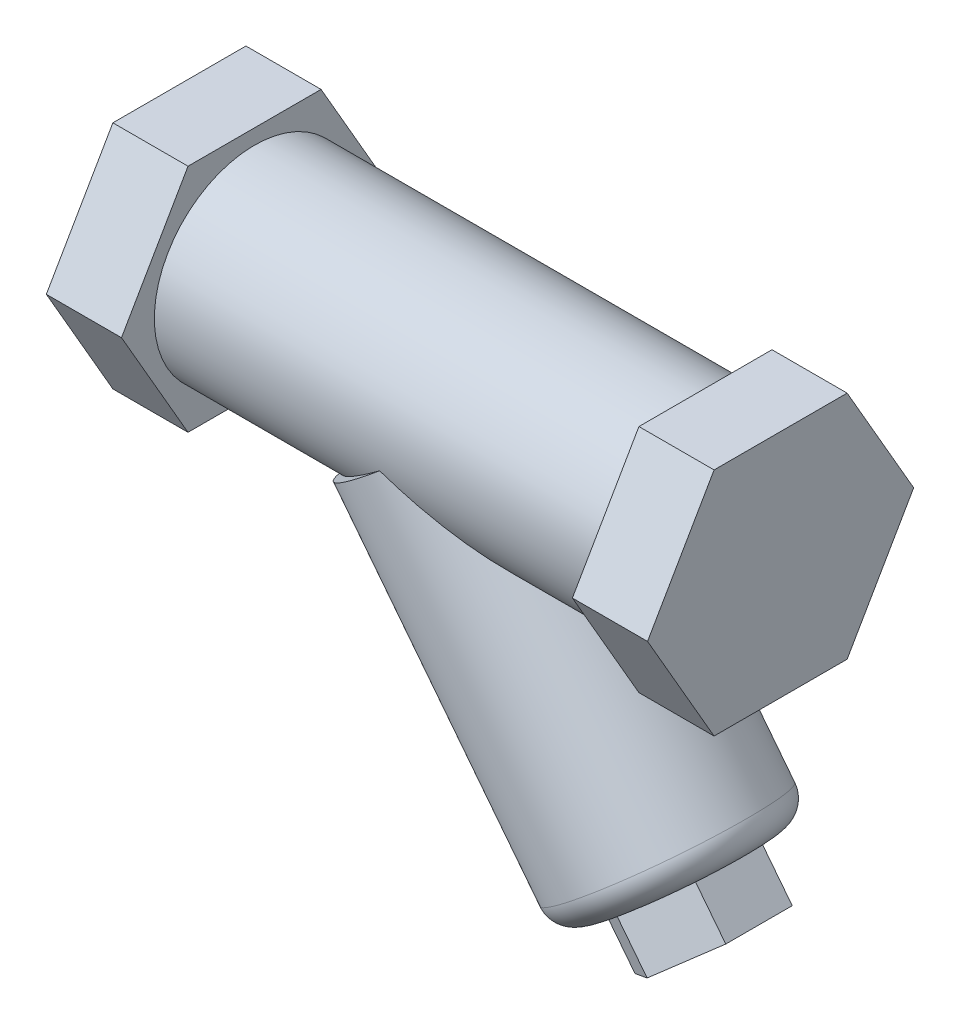
ISO-10303-21;
HEADER;
FILE_DESCRIPTION(('STEP AP214'),'2;1');
FILE_NAME('part.step','',(''),(''),'','','');
FILE_SCHEMA(('AUTOMOTIVE_DESIGN { 1 0 10303 214 1 1 1 1 }'));
ENDSEC;
DATA;
#1=APPLICATION_CONTEXT('core data for automotive mechanical design processes');
#2=APPLICATION_PROTOCOL_DEFINITION('international standard','automotive_design',2000,#1);
#3=PRODUCT_CONTEXT('',#1,'mechanical');
#4=PRODUCT('Part','Part','',(#3));
#5=PRODUCT_RELATED_PRODUCT_CATEGORY('part','',(#4));
#6=PRODUCT_DEFINITION_FORMATION('','',#4);
#7=PRODUCT_DEFINITION_CONTEXT('part definition',#1,'design');
#8=PRODUCT_DEFINITION('design','',#6,#7);
#9=PRODUCT_DEFINITION_SHAPE('','',#8);
#10=(LENGTH_UNIT() NAMED_UNIT(*) SI_UNIT(.MILLI.,.METRE.));
#11=(NAMED_UNIT(*) PLANE_ANGLE_UNIT() SI_UNIT($,.RADIAN.));
#12=(NAMED_UNIT(*) SI_UNIT($,.STERADIAN.) SOLID_ANGLE_UNIT());
#13=UNCERTAINTY_MEASURE_WITH_UNIT(LENGTH_MEASURE(1.E-05),#10,'distance_accuracy_value','');
#14=(GEOMETRIC_REPRESENTATION_CONTEXT(3) GLOBAL_UNCERTAINTY_ASSIGNED_CONTEXT((#13)) GLOBAL_UNIT_ASSIGNED_CONTEXT((#10,
#11,#12)) REPRESENTATION_CONTEXT('',''));
#15=CARTESIAN_POINT('',(0.,0.,0.));
#16=DIRECTION('',(0.,0.,1.));
#17=DIRECTION('',(1.,0.,0.));
#18=AXIS2_PLACEMENT_3D('',#15,#16,#17);
#19=CARTESIAN_POINT('',(100.474515380728,-63.6307453909227,1.58206781009085E-12));
#20=DIRECTION('',(-0.61566147532566,0.788010753606721,0.));
#21=DIRECTION('',(-0.788010753606721,-0.61566147532566,0.));
#22=AXIS2_PLACEMENT_3D('',#19,#20,#21);
#23=PLANE('',#22);
#24=CARTESIAN_POINT('',(100.474515380728,-63.6307453909227,1.58206781009085E-12));
#25=DIRECTION('',(-0.61566147532566,0.788010753606721,0.));
#26=DIRECTION('',(-0.788010753606721,-0.61566147532566,0.));
#27=AXIS2_PLACEMENT_3D('',#24,#25,#26);
#28=CIRCLE('',#27,15.);
#29=CARTESIAN_POINT('',(88.6543540766277,-72.8656675208076,1.58206781009085E-12));
#30=VERTEX_POINT('',#29);
#31=EDGE_CURVE('E11',#30,#30,#28,.F.);
#32=ORIENTED_EDGE('',*,*,#31,.T.);
#33=EDGE_LOOP('',(#32));
#34=FACE_BOUND('',#33,.T.);
#35=DIRECTION('',(0.68243733107874,0.533178477763428,0.5));
#36=VECTOR('',#35,1.);
#37=CARTESIAN_POINT('',(100.474515380736,-63.6307453909227,-13.2715495680807));
#38=LINE('',#37,#36);
#39=CARTESIAN_POINT('',(100.474515380736,-63.6307453909227,-13.2715495680807));
#40=VERTEX_POINT('',#39);
#41=CARTESIAN_POINT('',(109.531516247257,-56.5546407946506,-6.63577478404087));
#42=VERTEX_POINT('',#41);
#43=EDGE_CURVE('E196',#40,#42,#38,.T.);
#44=ORIENTED_EDGE('',*,*,#43,.F.);
#45=DIRECTION('',(0.682437331078741,0.533178477763427,-0.5));
#46=VECTOR('',#45,1.);
#47=CARTESIAN_POINT('',(91.4175145142142,-70.7068499871962,-6.63577478403984));
#48=LINE('',#47,#46);
#49=CARTESIAN_POINT('',(91.4175145142142,-70.7068499871962,-6.63577478403984));
#50=VERTEX_POINT('',#49);
#51=EDGE_CURVE('E193',#50,#40,#48,.T.);
#52=ORIENTED_EDGE('',*,*,#51,.F.);
#53=DIRECTION('',(0.,0.,-1.));
#54=VECTOR('',#53,1.);
#55=CARTESIAN_POINT('',(91.4175145142071,-70.7068499871962,6.63577478404267));
#56=LINE('',#55,#54);
#57=CARTESIAN_POINT('',(91.4175145142071,-70.7068499871962,6.63577478404267));
#58=VERTEX_POINT('',#57);
#59=EDGE_CURVE('E641',#58,#50,#56,.T.);
#60=ORIENTED_EDGE('',*,*,#59,.F.);
#61=DIRECTION('',(-0.68243733107874,-0.533178477763427,-0.5));
#62=VECTOR('',#61,1.);
#63=CARTESIAN_POINT('',(100.474515380728,-63.6307453909227,13.2715495680845));
#64=LINE('',#63,#62);
#65=CARTESIAN_POINT('',(100.474515380728,-63.6307453909227,13.2715495680845));
#66=VERTEX_POINT('',#65);
#67=EDGE_CURVE('E656',#66,#58,#64,.T.);
#68=ORIENTED_EDGE('',*,*,#67,.F.);
#69=DIRECTION('',(-0.682437331078741,-0.533178477763428,0.5));
#70=VECTOR('',#69,1.);
#71=CARTESIAN_POINT('',(109.53151624725,-56.5546407946506,6.63577478404176));
#72=LINE('',#71,#70);
#73=CARTESIAN_POINT('',(109.53151624725,-56.5546407946506,6.63577478404176));
#74=VERTEX_POINT('',#73);
#75=EDGE_CURVE('E59',#74,#66,#72,.T.);
#76=ORIENTED_EDGE('',*,*,#75,.F.);
#77=DIRECTION('',(0.,0.,1.));
#78=VECTOR('',#77,1.);
#79=CARTESIAN_POINT('',(109.531516247257,-56.5546407946506,-6.63577478404087));
#80=LINE('',#79,#78);
#81=EDGE_CURVE('E54',#42,#74,#80,.T.);
#82=ORIENTED_EDGE('',*,*,#81,.F.);
#83=EDGE_LOOP('',(#44,#52,#60,#68,#76,#82));
#84=FACE_BOUND('',#83,.T.);
#85=ADVANCED_FACE('F39',(#34,#84),#23,.F.);
#86=CARTESIAN_POINT('',(15.0000000000077,0.,-26.5581123827227));
#87=DIRECTION('',(1.,0.,0.));
#88=DIRECTION('',(0.,0.,-1.));
#89=AXIS2_PLACEMENT_3D('',#86,#87,#88);
#90=PLANE('',#89);
#91=DIRECTION('',(0.,0.866025403784439,-0.5));
#92=VECTOR('',#91,1.);
#93=CARTESIAN_POINT('',(15.0000000000077,-22.9999999999999,-13.2790561913609));
#94=LINE('',#93,#92);
#95=CARTESIAN_POINT('',(15.0000000000077,-22.9999999999999,-13.2790561913609));
#96=VERTEX_POINT('',#95);
#97=CARTESIAN_POINT('',(15.0000000000077,0.,-26.5581123827227));
#98=VERTEX_POINT('',#97);
#99=EDGE_CURVE('E257',#96,#98,#94,.T.);
#100=ORIENTED_EDGE('',*,*,#99,.T.);
#101=DIRECTION('',(0.,0.866025403784438,0.5));
#102=VECTOR('',#101,1.);
#103=CARTESIAN_POINT('',(15.0000000000077,0.,-26.5581123827227));
#104=LINE('',#103,#102);
#105=CARTESIAN_POINT('',(15.0000000000077,23.0000000000001,-13.2790561913609));
#106=VERTEX_POINT('',#105);
#107=EDGE_CURVE('E260',#98,#106,#104,.T.);
#108=ORIENTED_EDGE('',*,*,#107,.T.);
#109=DIRECTION('',(0.,0.,1.));
#110=VECTOR('',#109,1.);
#111=CARTESIAN_POINT('',(15.0000000000077,23.0000000000001,-13.2790561913609));
#112=LINE('',#111,#110);
#113=CARTESIAN_POINT('',(15.0000000000006,23.0000000000031,13.2790561913618));
#114=VERTEX_POINT('',#113);
#115=EDGE_CURVE('E263',#106,#114,#112,.T.);
#116=ORIENTED_EDGE('',*,*,#115,.T.);
#117=DIRECTION('',(0.,-0.866025403784438,0.5));
#118=VECTOR('',#117,1.);
#119=CARTESIAN_POINT('',(15.0000000000006,23.0000000000031,13.2790561913618));
#120=LINE('',#119,#118);
#121=CARTESIAN_POINT('',(15.0000000000006,3.21964677141295E-12,26.5581123827228));
#122=VERTEX_POINT('',#121);
#123=EDGE_CURVE('E265',#114,#122,#120,.T.);
#124=ORIENTED_EDGE('',*,*,#123,.T.);
#125=DIRECTION('',(0.,-0.866025403784438,-0.5));
#126=VECTOR('',#125,1.);
#127=CARTESIAN_POINT('',(15.0000000000006,3.21964677141295E-12,26.5581123827228));
#128=LINE('',#127,#126);
#129=CARTESIAN_POINT('',(15.0000000000006,-22.9999999999969,13.2790561913618));
#130=VERTEX_POINT('',#129);
#131=EDGE_CURVE('E267',#122,#130,#128,.T.);
#132=ORIENTED_EDGE('',*,*,#131,.T.);
#133=DIRECTION('',(0.,0.,-1.));
#134=VECTOR('',#133,1.);
#135=CARTESIAN_POINT('',(15.0000000000006,-22.9999999999969,13.2790561913618));
#136=LINE('',#135,#134);
#137=EDGE_CURVE('E269',#130,#96,#136,.T.);
#138=ORIENTED_EDGE('',*,*,#137,.T.);
#139=EDGE_LOOP('',(#100,#108,#116,#124,#132,#138));
#140=FACE_BOUND('',#139,.T.);
#141=CARTESIAN_POINT('',(15.0000000000006,3.21964677141295E-12,0.));
#142=DIRECTION('',(1.,0.,0.));
#143=DIRECTION('',(0.,0.,-1.));
#144=AXIS2_PLACEMENT_3D('',#141,#142,#143);
#145=CIRCLE('',#144,20.);
#146=CARTESIAN_POINT('',(15.0000000000006,3.21964677141295E-12,-19.9999999999999));
#147=VERTEX_POINT('',#146);
#148=EDGE_CURVE('E250',#147,#147,#145,.T.);
#149=ORIENTED_EDGE('',*,*,#148,.F.);
#150=EDGE_LOOP('',(#149));
#151=FACE_BOUND('',#150,.T.);
#152=ADVANCED_FACE('F335',(#140,#151),#90,.T.);
#153=CARTESIAN_POINT('',(15.0000000000077,-22.9999999999999,-13.2790561913609));
#154=DIRECTION('',(0.,0.5,0.866025403784439));
#155=DIRECTION('',(0.,-0.866025403784439,0.5));
#156=AXIS2_PLACEMENT_3D('',#153,#154,#155);
#157=PLANE('',#156);
#158=DIRECTION('',(0.,0.866025403784439,-0.5));
#159=VECTOR('',#158,1.);
#160=CARTESIAN_POINT('',(7.105427357601E-12,-22.999999999999,-13.2790561913615));
#161=LINE('',#160,#159);
#162=CARTESIAN_POINT('',(7.105427357601E-12,-22.999999999999,-13.2790561913615));
#163=VERTEX_POINT('',#162);
#164=CARTESIAN_POINT('',(7.105427357601E-12,8.88178419700125E-13,-26.5581123827231));
#165=VERTEX_POINT('',#164);
#166=EDGE_CURVE('E254',#163,#165,#161,.T.);
#167=ORIENTED_EDGE('',*,*,#166,.T.);
#168=DIRECTION('',(-1.,0.,0.));
#169=VECTOR('',#168,1.);
#170=CARTESIAN_POINT('',(15.0000000000077,0.,-26.5581123827227));
#171=LINE('',#170,#169);
#172=EDGE_CURVE('E297',#98,#165,#171,.T.);
#173=ORIENTED_EDGE('',*,*,#172,.F.);
#174=ORIENTED_EDGE('',*,*,#99,.F.);
#175=DIRECTION('',(-1.,0.,0.));
#176=VECTOR('',#175,1.);
#177=CARTESIAN_POINT('',(15.0000000000077,-22.9999999999999,-13.2790561913609));
#178=LINE('',#177,#176);
#179=EDGE_CURVE('E271',#96,#163,#178,.T.);
#180=ORIENTED_EDGE('',*,*,#179,.T.);
#181=EDGE_LOOP('',(#167,#173,#174,#180));
#182=FACE_BOUND('',#181,.T.);
#183=ADVANCED_FACE('F340',(#182),#157,.F.);
#184=CARTESIAN_POINT('',(15.0000000000077,0.,-26.5581123827227));
#185=DIRECTION('',(0.,-0.5,0.866025403784438));
#186=DIRECTION('',(0.,-0.866025403784439,-0.5));
#187=AXIS2_PLACEMENT_3D('',#184,#185,#186);
#188=PLANE('',#187);
#189=DIRECTION('',(0.,0.866025403784438,0.5));
#190=VECTOR('',#189,1.);
#191=CARTESIAN_POINT('',(7.105427357601E-12,8.88178419700125E-13,-26.5581123827231));
#192=LINE('',#191,#190);
#193=CARTESIAN_POINT('',(7.105427357601E-12,23.000000000001,-13.2790561913616));
#194=VERTEX_POINT('',#193);
#195=EDGE_CURVE('E274',#165,#194,#192,.T.);
#196=ORIENTED_EDGE('',*,*,#195,.T.);
#197=DIRECTION('',(-1.,0.,0.));
#198=VECTOR('',#197,1.);
#199=CARTESIAN_POINT('',(15.0000000000077,23.0000000000001,-13.2790561913609));
#200=LINE('',#199,#198);
#201=EDGE_CURVE('E294',#106,#194,#200,.T.);
#202=ORIENTED_EDGE('',*,*,#201,.F.);
#203=ORIENTED_EDGE('',*,*,#107,.F.);
#204=ORIENTED_EDGE('',*,*,#172,.T.);
#205=EDGE_LOOP('',(#196,#202,#203,#204));
#206=FACE_BOUND('',#205,.T.);
#207=ADVANCED_FACE('F568',(#206),#188,.F.);
#208=CARTESIAN_POINT('',(15.0000000000077,23.0000000000001,-13.2790561913609));
#209=DIRECTION('',(0.,-1.,0.));
#210=DIRECTION('',(0.,0.,-1.));
#211=AXIS2_PLACEMENT_3D('',#208,#209,#210);
#212=PLANE('',#211);
#213=DIRECTION('',(0.,0.,1.));
#214=VECTOR('',#213,1.);
#215=CARTESIAN_POINT('',(7.105427357601E-12,23.000000000001,-13.2790561913616));
#216=LINE('',#215,#214);
#217=CARTESIAN_POINT('',(0.,23.0000000000038,13.2790561913611));
#218=VERTEX_POINT('',#217);
#219=EDGE_CURVE('E276',#194,#218,#216,.T.);
#220=ORIENTED_EDGE('',*,*,#219,.T.);
#221=DIRECTION('',(-1.,0.,0.));
#222=VECTOR('',#221,1.);
#223=CARTESIAN_POINT('',(15.0000000000006,23.0000000000031,13.2790561913618));
#224=LINE('',#223,#222);
#225=EDGE_CURVE('E291',#114,#218,#224,.T.);
#226=ORIENTED_EDGE('',*,*,#225,.F.);
#227=ORIENTED_EDGE('',*,*,#115,.F.);
#228=ORIENTED_EDGE('',*,*,#201,.T.);
#229=EDGE_LOOP('',(#220,#226,#227,#228));
#230=FACE_BOUND('',#229,.T.);
#231=ADVANCED_FACE('F558',(#230),#212,.F.);
#232=CARTESIAN_POINT('',(15.0000000000006,23.0000000000031,13.2790561913618));
#233=DIRECTION('',(0.,-0.5,-0.866025403784438));
#234=DIRECTION('',(0.,0.866025403784439,-0.5));
#235=AXIS2_PLACEMENT_3D('',#232,#233,#234);
#236=PLANE('',#235);
#237=DIRECTION('',(0.,-0.866025403784438,0.5));
#238=VECTOR('',#237,1.);
#239=CARTESIAN_POINT('',(0.,23.0000000000038,13.2790561913611));
#240=LINE('',#239,#238);
#241=CARTESIAN_POINT('',(0.,3.66373598126302E-12,26.5581123827224));
#242=VERTEX_POINT('',#241);
#243=EDGE_CURVE('E278',#218,#242,#240,.T.);
#244=ORIENTED_EDGE('',*,*,#243,.T.);
#245=DIRECTION('',(-1.,0.,0.));
#246=VECTOR('',#245,1.);
#247=CARTESIAN_POINT('',(15.0000000000006,3.21964677141295E-12,26.5581123827228));
#248=LINE('',#247,#246);
#249=EDGE_CURVE('E288',#122,#242,#248,.T.);
#250=ORIENTED_EDGE('',*,*,#249,.F.);
#251=ORIENTED_EDGE('',*,*,#123,.F.);
#252=ORIENTED_EDGE('',*,*,#225,.T.);
#253=EDGE_LOOP('',(#244,#250,#251,#252));
#254=FACE_BOUND('',#253,.T.);
#255=ADVANCED_FACE('F548',(#254),#236,.F.);
#256=CARTESIAN_POINT('',(15.0000000000006,3.21964677141295E-12,26.5581123827228));
#257=DIRECTION('',(0.,0.5,-0.866025403784438));
#258=DIRECTION('',(0.,0.866025403784439,0.5));
#259=AXIS2_PLACEMENT_3D('',#256,#257,#258);
#260=PLANE('',#259);
#261=DIRECTION('',(0.,-0.866025403784438,-0.5));
#262=VECTOR('',#261,1.);
#263=CARTESIAN_POINT('',(0.,3.66373598126302E-12,26.5581123827224));
#264=LINE('',#263,#262);
#265=CARTESIAN_POINT('',(0.,-22.9999999999962,13.2790561913614));
#266=VERTEX_POINT('',#265);
#267=EDGE_CURVE('E280',#242,#266,#264,.T.);
#268=ORIENTED_EDGE('',*,*,#267,.T.);
#269=DIRECTION('',(-1.,0.,0.));
#270=VECTOR('',#269,1.);
#271=CARTESIAN_POINT('',(15.0000000000006,-22.9999999999969,13.2790561913618));
#272=LINE('',#271,#270);
#273=EDGE_CURVE('E285',#130,#266,#272,.T.);
#274=ORIENTED_EDGE('',*,*,#273,.F.);
#275=ORIENTED_EDGE('',*,*,#131,.F.);
#276=ORIENTED_EDGE('',*,*,#249,.T.);
#277=EDGE_LOOP('',(#268,#274,#275,#276));
#278=FACE_BOUND('',#277,.T.);
#279=ADVANCED_FACE('F538',(#278),#260,.F.);
#280=CARTESIAN_POINT('',(15.0000000000006,-22.9999999999969,13.2790561913618));
#281=DIRECTION('',(0.,1.,0.));
#282=DIRECTION('',(0.,0.,1.));
#283=AXIS2_PLACEMENT_3D('',#280,#281,#282);
#284=PLANE('',#283);
#285=DIRECTION('',(0.,0.,-1.));
#286=VECTOR('',#285,1.);
#287=CARTESIAN_POINT('',(0.,-22.9999999999962,13.2790561913614));
#288=LINE('',#287,#286);
#289=EDGE_CURVE('E261',#266,#163,#288,.T.);
#290=ORIENTED_EDGE('',*,*,#289,.T.);
#291=ORIENTED_EDGE('',*,*,#179,.F.);
#292=ORIENTED_EDGE('',*,*,#137,.F.);
#293=ORIENTED_EDGE('',*,*,#273,.T.);
#294=EDGE_LOOP('',(#290,#291,#292,#293));
#295=FACE_BOUND('',#294,.T.);
#296=ADVANCED_FACE('F528',(#295),#284,.F.);
#297=CARTESIAN_POINT('',(7.105427357601E-12,8.88178419700125E-13,-26.5581123827231));
#298=DIRECTION('',(1.,0.,0.));
#299=DIRECTION('',(0.,0.,-1.));
#300=AXIS2_PLACEMENT_3D('',#297,#298,#299);
#301=PLANE('',#300);
#302=ORIENTED_EDGE('',*,*,#166,.F.);
#303=ORIENTED_EDGE('',*,*,#289,.F.);
#304=ORIENTED_EDGE('',*,*,#267,.F.);
#305=ORIENTED_EDGE('',*,*,#243,.F.);
#306=ORIENTED_EDGE('',*,*,#219,.F.);
#307=ORIENTED_EDGE('',*,*,#195,.F.);
#308=EDGE_LOOP('',(#302,#303,#304,#305,#306,#307));
#309=FACE_BOUND('',#308,.T.);
#310=ADVANCED_FACE('F518',(#309),#301,.F.);
#311=CARTESIAN_POINT('',(105.,3.66373598126302E-12,-1.13797860024079E-12));
#312=DIRECTION('',(-1.,0.,0.));
#313=DIRECTION('',(0.,0.,1.));
#314=AXIS2_PLACEMENT_3D('',#311,#312,#313);
#315=CYLINDRICAL_SURFACE('',#314,20.);
#316=CARTESIAN_POINT('',(50.7607286029028,3.66373598126302E-12,0.));
#317=DIRECTION('',(-0.898794046299167,0.438371146789077,0.));
#318=DIRECTION('',(-0.438371146789077,-0.898794046299167,0.));
#319=AXIS2_PLACEMENT_3D('',#316,#317,#318);
#320=ELLIPSE('',#319,22.2520388095038,20.);
#321=CARTESIAN_POINT('',(42.0121536631797,-17.9372368072715,-8.84621589832202));
#322=VERTEX_POINT('',#321);
#323=CARTESIAN_POINT('',(42.0121536631726,-17.9372368072715,8.84621589832213));
#324=VERTEX_POINT('',#323);
#325=EDGE_CURVE('E307',#322,#324,#320,.T.);
#326=ORIENTED_EDGE('',*,*,#325,.T.);
#327=CARTESIAN_POINT('',(64.9707698193094,4.10782519111308E-12,0.));
#328=DIRECTION('',(-0.61566147532566,0.788010753606721,0.));
#329=DIRECTION('',(-0.788010753606721,-0.61566147532566,0.));
#330=AXIS2_PLACEMENT_3D('',#327,#328,#329);
#331=ELLIPSE('',#330,32.4853849096548,20.);
#332=CARTESIAN_POINT('',(59.5093035426348,-4.26696510161373,19.5395242731647));
#333=VERTEX_POINT('',#332);
#334=EDGE_CURVE('E304',#324,#333,#331,.T.);
#335=ORIENTED_EDGE('',*,*,#334,.T.);
#336=CARTESIAN_POINT('',(50.7607286029028,3.66373598126302E-12,0.));
#337=DIRECTION('',(-0.438371146789077,-0.898794046299167,0.));
#338=DIRECTION('',(-0.898794046299167,0.438371146789077,0.));
#339=AXIS2_PLACEMENT_3D('',#336,#337,#338);
#340=ELLIPSE('',#339,45.6234406540973,20.);
#341=CARTESIAN_POINT('',(59.5093035426419,-4.26696510161673,-19.5395242731639));
#342=VERTEX_POINT('',#341);
#343=EDGE_CURVE('E303',#333,#342,#340,.F.);
#344=ORIENTED_EDGE('',*,*,#343,.T.);
#345=EDGE_CURVE('E300',#342,#322,#331,.T.);
#346=ORIENTED_EDGE('',*,*,#345,.T.);
#347=EDGE_LOOP('',(#326,#335,#344,#346));
#348=FACE_BOUND('',#347,.T.);
#349=CARTESIAN_POINT('',(105.,3.66373598126302E-12,-1.13797860024079E-12));
#350=DIRECTION('',(1.,0.,0.));
#351=DIRECTION('',(0.,0.,-1.));
#352=AXIS2_PLACEMENT_3D('',#349,#350,#351);
#353=CIRCLE('',#352,20.);
#354=CARTESIAN_POINT('',(105.,3.66373598126302E-12,-20.0000000000011));
#355=VERTEX_POINT('',#354);
#356=EDGE_CURVE('E251',#355,#355,#353,.T.);
#357=ORIENTED_EDGE('',*,*,#356,.F.);
#358=EDGE_LOOP('',(#357));
#359=FACE_BOUND('',#358,.T.);
#360=ORIENTED_EDGE('',*,*,#148,.T.);
#361=EDGE_LOOP('',(#360));
#362=FACE_BOUND('',#361,.T.);
#363=ADVANCED_FACE('F314',(#348,#359,#362),#315,.T.);
#364=CARTESIAN_POINT('',(105.000000000006,23.0000000000008,-39.8371685740841));
#365=DIRECTION('',(1.,0.,0.));
#366=DIRECTION('',(0.,0.,-1.));
#367=AXIS2_PLACEMENT_3D('',#364,#365,#366);
#368=PLANE('',#367);
#369=DIRECTION('',(0.,0.866025403784439,-0.5));
#370=VECTOR('',#369,1.);
#371=CARTESIAN_POINT('',(105.000000000008,-22.9999999999962,-13.2790561913614));
#372=LINE('',#371,#370);
#373=CARTESIAN_POINT('',(105.000000000008,-22.9999999999962,-13.2790561913614));
#374=VERTEX_POINT('',#373);
#375=CARTESIAN_POINT('',(105.000000000008,8.88178419700125E-13,-26.558112382724));
#376=VERTEX_POINT('',#375);
#377=EDGE_CURVE('E206',#374,#376,#372,.T.);
#378=ORIENTED_EDGE('',*,*,#377,.F.);
#379=DIRECTION('',(0.,0.,-1.));
#380=VECTOR('',#379,1.);
#381=CARTESIAN_POINT('',(105.,-22.9999999999962,13.2790561913614));
#382=LINE('',#381,#380);
#383=CARTESIAN_POINT('',(105.,-22.9999999999962,13.2790561913614));
#384=VERTEX_POINT('',#383);
#385=EDGE_CURVE('E211',#384,#374,#382,.T.);
#386=ORIENTED_EDGE('',*,*,#385,.F.);
#387=DIRECTION('',(0.,-0.866025403784439,-0.5));
#388=VECTOR('',#387,1.);
#389=CARTESIAN_POINT('',(105.,3.66373598126302E-12,26.5581123827216));
#390=LINE('',#389,#388);
#391=CARTESIAN_POINT('',(105.,3.66373598126302E-12,26.5581123827216));
#392=VERTEX_POINT('',#391);
#393=EDGE_CURVE('E230',#392,#384,#390,.T.);
#394=ORIENTED_EDGE('',*,*,#393,.F.);
#395=DIRECTION('',(0.,-0.866025403784439,0.5));
#396=VECTOR('',#395,1.);
#397=CARTESIAN_POINT('',(105.,23.0000000000038,13.2790561913623));
#398=LINE('',#397,#396);
#399=CARTESIAN_POINT('',(105.,23.0000000000038,13.2790561913623));
#400=VERTEX_POINT('',#399);
#401=EDGE_CURVE('E228',#400,#392,#398,.T.);
#402=ORIENTED_EDGE('',*,*,#401,.F.);
#403=DIRECTION('',(0.,0.,1.));
#404=VECTOR('',#403,1.);
#405=CARTESIAN_POINT('',(105.000000000008,23.0000000000038,-13.2790561913605));
#406=LINE('',#405,#404);
#407=CARTESIAN_POINT('',(105.000000000008,23.0000000000038,-13.2790561913605));
#408=VERTEX_POINT('',#407);
#409=EDGE_CURVE('E226',#408,#400,#406,.T.);
#410=ORIENTED_EDGE('',*,*,#409,.F.);
#411=DIRECTION('',(0.,0.866025403784438,0.5));
#412=VECTOR('',#411,1.);
#413=CARTESIAN_POINT('',(105.000000000008,8.88178419700125E-13,-26.558112382724));
#414=LINE('',#413,#412);
#415=EDGE_CURVE('E224',#376,#408,#414,.T.);
#416=ORIENTED_EDGE('',*,*,#415,.F.);
#417=EDGE_LOOP('',(#378,#386,#394,#402,#410,#416));
#418=FACE_BOUND('',#417,.T.);
#419=ORIENTED_EDGE('',*,*,#356,.T.);
#420=EDGE_LOOP('',(#419));
#421=FACE_BOUND('',#420,.T.);
#422=ADVANCED_FACE('F499',(#418,#421),#368,.F.);
#423=CARTESIAN_POINT('',(120.000000000008,-22.9999999999962,-13.2790561913615));
#424=DIRECTION('',(0.,0.5,0.866025403784439));
#425=DIRECTION('',(0.,-0.866025403784439,0.5));
#426=AXIS2_PLACEMENT_3D('',#423,#424,#425);
#427=PLANE('',#426);
#428=ORIENTED_EDGE('',*,*,#377,.T.);
#429=DIRECTION('',(-1.,0.,0.));
#430=VECTOR('',#429,1.);
#431=CARTESIAN_POINT('',(120.000000000006,8.88178419700125E-13,-26.5581123827228));
#432=LINE('',#431,#430);
#433=CARTESIAN_POINT('',(120.000000000006,8.88178419700125E-13,-26.5581123827228));
#434=VERTEX_POINT('',#433);
#435=EDGE_CURVE('E247',#434,#376,#432,.T.);
#436=ORIENTED_EDGE('',*,*,#435,.F.);
#437=DIRECTION('',(0.,0.866025403784439,-0.5));
#438=VECTOR('',#437,1.);
#439=CARTESIAN_POINT('',(120.000000000008,-22.9999999999962,-13.2790561913615));
#440=LINE('',#439,#438);
#441=CARTESIAN_POINT('',(120.000000000008,-22.9999999999962,-13.2790561913615));
#442=VERTEX_POINT('',#441);
#443=EDGE_CURVE('E207',#442,#434,#440,.T.);
#444=ORIENTED_EDGE('',*,*,#443,.F.);
#445=DIRECTION('',(-1.,0.,0.));
#446=VECTOR('',#445,1.);
#447=CARTESIAN_POINT('',(120.000000000008,-22.9999999999962,-13.2790561913615));
#448=LINE('',#447,#446);
#449=EDGE_CURVE('E221',#442,#374,#448,.T.);
#450=ORIENTED_EDGE('',*,*,#449,.T.);
#451=EDGE_LOOP('',(#428,#436,#444,#450));
#452=FACE_BOUND('',#451,.T.);
#453=ADVANCED_FACE('F489',(#452),#427,.F.);
#454=CARTESIAN_POINT('',(120.000000000006,8.88178419700125E-13,-26.5581123827228));
#455=DIRECTION('',(0.,-0.5,0.866025403784438));
#456=DIRECTION('',(0.,-0.866025403784438,-0.500000000000001));
#457=AXIS2_PLACEMENT_3D('',#454,#455,#456);
#458=PLANE('',#457);
#459=ORIENTED_EDGE('',*,*,#415,.T.);
#460=DIRECTION('',(-1.,0.,0.));
#461=VECTOR('',#460,1.);
#462=CARTESIAN_POINT('',(120.000000000008,23.0000000000038,-13.2790561913614));
#463=LINE('',#462,#461);
#464=CARTESIAN_POINT('',(120.000000000008,23.0000000000038,-13.2790561913614));
#465=VERTEX_POINT('',#464);
#466=EDGE_CURVE('E244',#465,#408,#463,.T.);
#467=ORIENTED_EDGE('',*,*,#466,.F.);
#468=DIRECTION('',(0.,0.866025403784438,0.5));
#469=VECTOR('',#468,1.);
#470=CARTESIAN_POINT('',(120.000000000006,8.88178419700125E-13,-26.5581123827228));
#471=LINE('',#470,#469);
#472=EDGE_CURVE('E210',#434,#465,#471,.T.);
#473=ORIENTED_EDGE('',*,*,#472,.F.);
#474=ORIENTED_EDGE('',*,*,#435,.T.);
#475=EDGE_LOOP('',(#459,#467,#473,#474));
#476=FACE_BOUND('',#475,.T.);
#477=ADVANCED_FACE('F479',(#476),#458,.F.);
#478=CARTESIAN_POINT('',(120.000000000008,23.0000000000038,-13.2790561913614));
#479=DIRECTION('',(0.,-1.,0.));
#480=DIRECTION('',(0.,0.,-1.));
#481=AXIS2_PLACEMENT_3D('',#478,#479,#480);
#482=PLANE('',#481);
#483=ORIENTED_EDGE('',*,*,#409,.T.);
#484=DIRECTION('',(-1.,0.,0.));
#485=VECTOR('',#484,1.);
#486=CARTESIAN_POINT('',(120.000000000001,23.0000000000038,13.2790561913614));
#487=LINE('',#486,#485);
#488=CARTESIAN_POINT('',(120.000000000001,23.0000000000038,13.2790561913614));
#489=VERTEX_POINT('',#488);
#490=EDGE_CURVE('E241',#489,#400,#487,.T.);
#491=ORIENTED_EDGE('',*,*,#490,.F.);
#492=DIRECTION('',(0.,0.,1.));
#493=VECTOR('',#492,1.);
#494=CARTESIAN_POINT('',(120.000000000008,23.0000000000038,-13.2790561913614));
#495=LINE('',#494,#493);
#496=EDGE_CURVE('E213',#465,#489,#495,.T.);
#497=ORIENTED_EDGE('',*,*,#496,.F.);
#498=ORIENTED_EDGE('',*,*,#466,.T.);
#499=EDGE_LOOP('',(#483,#491,#497,#498));
#500=FACE_BOUND('',#499,.T.);
#501=ADVANCED_FACE('F469',(#500),#482,.F.);
#502=CARTESIAN_POINT('',(120.000000000001,23.0000000000038,13.2790561913614));
#503=DIRECTION('',(0.,-0.5,-0.866025403784439));
#504=DIRECTION('',(0.,0.866025403784439,-0.5));
#505=AXIS2_PLACEMENT_3D('',#502,#503,#504);
#506=PLANE('',#505);
#507=ORIENTED_EDGE('',*,*,#401,.T.);
#508=DIRECTION('',(-1.,0.,0.));
#509=VECTOR('',#508,1.);
#510=CARTESIAN_POINT('',(120.000000000001,3.66373598126302E-12,26.5581123827228));
#511=LINE('',#510,#509);
#512=CARTESIAN_POINT('',(120.000000000001,3.66373598126302E-12,26.5581123827228));
#513=VERTEX_POINT('',#512);
#514=EDGE_CURVE('E238',#513,#392,#511,.T.);
#515=ORIENTED_EDGE('',*,*,#514,.F.);
#516=DIRECTION('',(0.,-0.866025403784439,0.5));
#517=VECTOR('',#516,1.);
#518=CARTESIAN_POINT('',(120.000000000001,23.0000000000038,13.2790561913614));
#519=LINE('',#518,#517);
#520=EDGE_CURVE('E215',#489,#513,#519,.T.);
#521=ORIENTED_EDGE('',*,*,#520,.F.);
#522=ORIENTED_EDGE('',*,*,#490,.T.);
#523=EDGE_LOOP('',(#507,#515,#521,#522));
#524=FACE_BOUND('',#523,.T.);
#525=ADVANCED_FACE('F459',(#524),#506,.F.);
#526=CARTESIAN_POINT('',(120.000000000001,3.66373598126302E-12,26.5581123827228));
#527=DIRECTION('',(0.,0.5,-0.866025403784439));
#528=DIRECTION('',(0.,0.866025403784439,0.5));
#529=AXIS2_PLACEMENT_3D('',#526,#527,#528);
#530=PLANE('',#529);
#531=ORIENTED_EDGE('',*,*,#393,.T.);
#532=DIRECTION('',(-1.,0.,0.));
#533=VECTOR('',#532,1.);
#534=CARTESIAN_POINT('',(120.000000000001,-22.9999999999962,13.2790561913614));
#535=LINE('',#534,#533);
#536=CARTESIAN_POINT('',(120.000000000001,-22.9999999999962,13.2790561913614));
#537=VERTEX_POINT('',#536);
#538=EDGE_CURVE('E235',#537,#384,#535,.T.);
#539=ORIENTED_EDGE('',*,*,#538,.F.);
#540=DIRECTION('',(0.,-0.866025403784439,-0.5));
#541=VECTOR('',#540,1.);
#542=CARTESIAN_POINT('',(120.000000000001,3.66373598126302E-12,26.5581123827228));
#543=LINE('',#542,#541);
#544=EDGE_CURVE('E217',#513,#537,#543,.T.);
#545=ORIENTED_EDGE('',*,*,#544,.F.);
#546=ORIENTED_EDGE('',*,*,#514,.T.);
#547=EDGE_LOOP('',(#531,#539,#545,#546));
#548=FACE_BOUND('',#547,.T.);
#549=ADVANCED_FACE('F449',(#548),#530,.F.);
#550=CARTESIAN_POINT('',(120.000000000001,-22.9999999999962,13.2790561913614));
#551=DIRECTION('',(0.,1.,0.));
#552=DIRECTION('',(0.,0.,1.));
#553=AXIS2_PLACEMENT_3D('',#550,#551,#552);
#554=PLANE('',#553);
#555=ORIENTED_EDGE('',*,*,#385,.T.);
#556=ORIENTED_EDGE('',*,*,#449,.F.);
#557=DIRECTION('',(0.,0.,-1.));
#558=VECTOR('',#557,1.);
#559=CARTESIAN_POINT('',(120.000000000001,-22.9999999999962,13.2790561913614));
#560=LINE('',#559,#558);
#561=EDGE_CURVE('E219',#537,#442,#560,.T.);
#562=ORIENTED_EDGE('',*,*,#561,.F.);
#563=ORIENTED_EDGE('',*,*,#538,.T.);
#564=EDGE_LOOP('',(#555,#556,#562,#563));
#565=FACE_BOUND('',#564,.T.);
#566=ADVANCED_FACE('F439',(#565),#554,.F.);
#567=CARTESIAN_POINT('',(120.000000000006,23.0000000000008,-39.8371685740841));
#568=DIRECTION('',(1.,0.,0.));
#569=DIRECTION('',(0.,0.,-1.));
#570=AXIS2_PLACEMENT_3D('',#567,#568,#569);
#571=PLANE('',#570);
#572=ORIENTED_EDGE('',*,*,#443,.T.);
#573=ORIENTED_EDGE('',*,*,#472,.T.);
#574=ORIENTED_EDGE('',*,*,#496,.T.);
#575=ORIENTED_EDGE('',*,*,#520,.T.);
#576=ORIENTED_EDGE('',*,*,#544,.T.);
#577=ORIENTED_EDGE('',*,*,#561,.T.);
#578=EDGE_LOOP('',(#572,#573,#574,#575,#576,#577));
#579=FACE_BOUND('',#578,.T.);
#580=ADVANCED_FACE('F431',(#579),#571,.T.);
#581=CARTESIAN_POINT('',(100.474515380728,-63.6307453909227,1.58206781009085E-12));
#582=DIRECTION('',(-0.61566147532566,0.788010753606721,0.));
#583=DIRECTION('',(-0.788010753606721,-0.61566147532566,0.));
#584=AXIS2_PLACEMENT_3D('',#581,#582,#583);
#585=CYLINDRICAL_SURFACE('',#584,20.);
#586=CARTESIAN_POINT('',(97.3962080041009,-59.6906916228891,1.2490009027033E-12));
#587=DIRECTION('',(-0.61566147532566,0.788010753606721,0.));
#588=DIRECTION('',(-0.788010753606721,-0.61566147532566,0.));
#589=AXIS2_PLACEMENT_3D('',#586,#587,#588);
#590=CIRCLE('',#589,20.);
#591=CARTESIAN_POINT('',(81.6359929319664,-72.0039211294023,1.2490009027033E-12));
#592=VERTEX_POINT('',#591);
#593=EDGE_CURVE('E47',#592,#592,#590,.T.);
#594=ORIENTED_EDGE('',*,*,#593,.T.);
#595=EDGE_LOOP('',(#594));
#596=FACE_BOUND('',#595,.T.);
#597=ORIENTED_EDGE('',*,*,#325,.F.);
#598=CARTESIAN_POINT('',(56.1468891572954,-6.89397113123869,0.));
#599=DIRECTION('',(-0.61566147532566,0.788010753606721,0.));
#600=DIRECTION('',(-0.788010753606721,-0.61566147532566,0.));
#601=AXIS2_PLACEMENT_3D('',#598,#599,#600);
#602=CIRCLE('',#601,20.);
#603=EDGE_CURVE('E197',#342,#322,#602,.T.);
#604=ORIENTED_EDGE('',*,*,#603,.F.);
#605=ORIENTED_EDGE('',*,*,#343,.F.);
#606=EDGE_CURVE('E199',#324,#333,#602,.T.);
#607=ORIENTED_EDGE('',*,*,#606,.F.);
#608=EDGE_LOOP('',(#597,#604,#605,#607));
#609=FACE_BOUND('',#608,.T.);
#610=ADVANCED_FACE('F321',(#596,#609),#585,.T.);
#611=CARTESIAN_POINT('',(56.1468891572954,-6.89397113123869,0.));
#612=DIRECTION('',(-0.61566147532566,0.788010753606721,0.));
#613=DIRECTION('',(-0.788010753606721,-0.61566147532566,0.));
#614=AXIS2_PLACEMENT_3D('',#611,#612,#613);
#615=PLANE('',#614);
#616=ORIENTED_EDGE('',*,*,#334,.F.);
#617=ORIENTED_EDGE('',*,*,#606,.T.);
#618=EDGE_LOOP('',(#616,#617));
#619=FACE_BOUND('',#618,.T.);
#620=ADVANCED_FACE('F319',(#619),#615,.T.);
#621=ORIENTED_EDGE('',*,*,#345,.F.);
#622=ORIENTED_EDGE('',*,*,#603,.T.);
#623=EDGE_LOOP('',(#621,#622));
#624=FACE_BOUND('',#623,.T.);
#625=ADVANCED_FACE('F324',(#624),#615,.T.);
#626=CARTESIAN_POINT('',(106.631130133993,-71.5108529269898,-13.2715495680825));
#627=DIRECTION('',(-0.394005376803361,-0.30783073766283,0.866025403784439));
#628=DIRECTION('',(0.910224889606064,0.,0.414114296229469));
#629=AXIS2_PLACEMENT_3D('',#626,#627,#628);
#630=PLANE('',#629);
#631=ORIENTED_EDGE('',*,*,#43,.T.);
#632=DIRECTION('',(-0.61566147532566,0.788010753606721,0.));
#633=VECTOR('',#632,1.);
#634=CARTESIAN_POINT('',(115.688131000514,-64.4347483307178,-6.6357747840412));
#635=LINE('',#634,#633);
#636=CARTESIAN_POINT('',(115.688131000514,-64.4347483307178,-6.6357747840412));
#637=VERTEX_POINT('',#636);
#638=EDGE_CURVE('E177',#637,#42,#635,.T.);
#639=ORIENTED_EDGE('',*,*,#638,.F.);
#640=DIRECTION('',(0.68243733107874,0.533178477763428,0.5));
#641=VECTOR('',#640,1.);
#642=CARTESIAN_POINT('',(106.631130133993,-71.5108529269898,-13.2715495680825));
#643=LINE('',#642,#641);
#644=CARTESIAN_POINT('',(106.631130133993,-71.5108529269898,-13.2715495680825));
#645=VERTEX_POINT('',#644);
#646=EDGE_CURVE('E184',#645,#637,#643,.T.);
#647=ORIENTED_EDGE('',*,*,#646,.F.);
#648=DIRECTION('',(-0.61566147532566,0.788010753606721,0.));
#649=VECTOR('',#648,1.);
#650=CARTESIAN_POINT('',(106.631130133993,-71.5108529269898,-13.2715495680825));
#651=LINE('',#650,#649);
#652=EDGE_CURVE('E637',#645,#40,#651,.T.);
#653=ORIENTED_EDGE('',*,*,#652,.T.);
#654=EDGE_LOOP('',(#631,#639,#647,#653));
#655=FACE_BOUND('',#654,.T.);
#656=ADVANCED_FACE('F195',(#655),#630,.F.);
#657=CARTESIAN_POINT('',(115.688131000514,-64.4347483307178,-6.6357747840412));
#658=DIRECTION('',(-0.788010753606721,-0.61566147532566,0.));
#659=DIRECTION('',(0.61566147532566,-0.788010753606721,0.));
#660=AXIS2_PLACEMENT_3D('',#657,#658,#659);
#661=PLANE('',#660);
#662=ORIENTED_EDGE('',*,*,#81,.T.);
#663=DIRECTION('',(-0.61566147532566,0.788010753606721,0.));
#664=VECTOR('',#663,1.);
#665=CARTESIAN_POINT('',(115.688131000507,-64.4347483307178,6.63577478404132));
#666=LINE('',#665,#664);
#667=CARTESIAN_POINT('',(115.688131000507,-64.4347483307178,6.63577478404132));
#668=VERTEX_POINT('',#667);
#669=EDGE_CURVE('E180',#668,#74,#666,.T.);
#670=ORIENTED_EDGE('',*,*,#669,.F.);
#671=DIRECTION('',(0.,0.,1.));
#672=VECTOR('',#671,1.);
#673=CARTESIAN_POINT('',(115.688131000514,-64.4347483307178,-6.6357747840412));
#674=LINE('',#673,#672);
#675=EDGE_CURVE('E173',#637,#668,#674,.T.);
#676=ORIENTED_EDGE('',*,*,#675,.F.);
#677=ORIENTED_EDGE('',*,*,#638,.T.);
#678=EDGE_LOOP('',(#662,#670,#676,#677));
#679=FACE_BOUND('',#678,.T.);
#680=ADVANCED_FACE('F175',(#679),#661,.F.);
#681=CARTESIAN_POINT('',(115.688131000507,-64.4347483307178,6.63577478404132));
#682=DIRECTION('',(-0.39400537680336,-0.30783073766283,-0.866025403784439));
#683=DIRECTION('',(-0.910224889606064,0.,0.414114296229469));
#684=AXIS2_PLACEMENT_3D('',#681,#682,#683);
#685=PLANE('',#684);
#686=ORIENTED_EDGE('',*,*,#75,.T.);
#687=DIRECTION('',(-0.61566147532566,0.788010753606721,0.));
#688=VECTOR('',#687,1.);
#689=CARTESIAN_POINT('',(106.631130133986,-71.5108529269898,13.2715495680826));
#690=LINE('',#689,#688);
#691=CARTESIAN_POINT('',(106.631130133986,-71.5108529269898,13.2715495680826));
#692=VERTEX_POINT('',#691);
#693=EDGE_CURVE('E201',#692,#66,#690,.T.);
#694=ORIENTED_EDGE('',*,*,#693,.F.);
#695=DIRECTION('',(-0.682437331078741,-0.533178477763428,0.5));
#696=VECTOR('',#695,1.);
#697=CARTESIAN_POINT('',(115.688131000507,-64.4347483307178,6.63577478404132));
#698=LINE('',#697,#696);
#699=EDGE_CURVE('E183',#668,#692,#698,.T.);
#700=ORIENTED_EDGE('',*,*,#699,.F.);
#701=ORIENTED_EDGE('',*,*,#669,.T.);
#702=EDGE_LOOP('',(#686,#694,#700,#701));
#703=FACE_BOUND('',#702,.T.);
#704=ADVANCED_FACE('F346',(#703),#685,.F.);
#705=CARTESIAN_POINT('',(106.631130133986,-71.5108529269898,13.2715495680826));
#706=DIRECTION('',(0.394005376803361,0.30783073766283,-0.866025403784438));
#707=DIRECTION('',(-0.910224889606064,0.,-0.414114296229469));
#708=AXIS2_PLACEMENT_3D('',#705,#706,#707);
#709=PLANE('',#708);
#710=ORIENTED_EDGE('',*,*,#67,.T.);
#711=DIRECTION('',(-0.61566147532566,0.788010753606721,0.));
#712=VECTOR('',#711,1.);
#713=CARTESIAN_POINT('',(97.5741292674641,-78.5869575232628,6.63577478404301));
#714=LINE('',#713,#712);
#715=CARTESIAN_POINT('',(97.5741292674641,-78.5869575232628,6.63577478404301));
#716=VERTEX_POINT('',#715);
#717=EDGE_CURVE('E644',#716,#58,#714,.T.);
#718=ORIENTED_EDGE('',*,*,#717,.F.);
#719=DIRECTION('',(-0.68243733107874,-0.533178477763427,-0.5));
#720=VECTOR('',#719,1.);
#721=CARTESIAN_POINT('',(106.631130133986,-71.5108529269898,13.2715495680826));
#722=LINE('',#721,#720);
#723=EDGE_CURVE('E657',#692,#716,#722,.T.);
#724=ORIENTED_EDGE('',*,*,#723,.F.);
#725=ORIENTED_EDGE('',*,*,#693,.T.);
#726=EDGE_LOOP('',(#710,#718,#724,#725));
#727=FACE_BOUND('',#726,.T.);
#728=ADVANCED_FACE('F349',(#727),#709,.F.);
#729=CARTESIAN_POINT('',(97.5741292674641,-78.5869575232628,6.63577478404301));
#730=DIRECTION('',(0.788010753606721,0.61566147532566,0.));
#731=DIRECTION('',(-0.61566147532566,0.788010753606721,0.));
#732=AXIS2_PLACEMENT_3D('',#729,#730,#731);
#733=PLANE('',#732);
#734=ORIENTED_EDGE('',*,*,#59,.T.);
#735=DIRECTION('',(-0.61566147532566,0.788010753606721,0.));
#736=VECTOR('',#735,1.);
#737=CARTESIAN_POINT('',(97.5741292674712,-78.5869575232628,-6.63577478403962));
#738=LINE('',#737,#736);
#739=CARTESIAN_POINT('',(97.5741292674712,-78.5869575232628,-6.63577478403962));
#740=VERTEX_POINT('',#739);
#741=EDGE_CURVE('E639',#740,#50,#738,.T.);
#742=ORIENTED_EDGE('',*,*,#741,.F.);
#743=DIRECTION('',(0.,0.,-1.));
#744=VECTOR('',#743,1.);
#745=CARTESIAN_POINT('',(97.5741292674641,-78.5869575232628,6.63577478404301));
#746=LINE('',#745,#744);
#747=EDGE_CURVE('E646',#716,#740,#746,.T.);
#748=ORIENTED_EDGE('',*,*,#747,.F.);
#749=ORIENTED_EDGE('',*,*,#717,.T.);
#750=EDGE_LOOP('',(#734,#742,#748,#749));
#751=FACE_BOUND('',#750,.T.);
#752=ADVANCED_FACE('F353',(#751),#733,.F.);
#753=CARTESIAN_POINT('',(97.5741292674712,-78.5869575232628,-6.63577478403962));
#754=DIRECTION('',(0.39400537680336,0.30783073766283,0.866025403784439));
#755=DIRECTION('',(0.910224889606064,0.,-0.414114296229469));
#756=AXIS2_PLACEMENT_3D('',#753,#754,#755);
#757=PLANE('',#756);
#758=ORIENTED_EDGE('',*,*,#51,.T.);
#759=ORIENTED_EDGE('',*,*,#652,.F.);
#760=DIRECTION('',(0.682437331078741,0.533178477763427,-0.5));
#761=VECTOR('',#760,1.);
#762=CARTESIAN_POINT('',(97.5741292674712,-78.5869575232628,-6.63577478403962));
#763=LINE('',#762,#761);
#764=EDGE_CURVE('E189',#740,#645,#763,.T.);
#765=ORIENTED_EDGE('',*,*,#764,.F.);
#766=ORIENTED_EDGE('',*,*,#741,.T.);
#767=EDGE_LOOP('',(#758,#759,#765,#766));
#768=FACE_BOUND('',#767,.T.);
#769=ADVANCED_FACE('F357',(#768),#757,.F.);
#770=CARTESIAN_POINT('',(115.688131000514,-64.4347483307178,-6.6357747840412));
#771=DIRECTION('',(0.61566147532566,-0.788010753606721,0.));
#772=DIRECTION('',(0.788010753606721,0.61566147532566,0.));
#773=AXIS2_PLACEMENT_3D('',#770,#771,#772);
#774=PLANE('',#773);
#775=ORIENTED_EDGE('',*,*,#646,.T.);
#776=ORIENTED_EDGE('',*,*,#675,.T.);
#777=ORIENTED_EDGE('',*,*,#699,.T.);
#778=ORIENTED_EDGE('',*,*,#723,.T.);
#779=ORIENTED_EDGE('',*,*,#747,.T.);
#780=ORIENTED_EDGE('',*,*,#764,.T.);
#781=EDGE_LOOP('',(#775,#776,#777,#778,#779,#780));
#782=FACE_BOUND('',#781,.T.);
#783=ADVANCED_FACE('F187',(#782),#774,.T.);
#784=CARTESIAN_POINT('',(97.3962080041009,-59.6906916228891,1.2490009027033E-12));
#785=DIRECTION('',(-0.61566147532566,0.788010753606721,0.));
#786=DIRECTION('',(-0.788010753606721,-0.61566147532566,0.));
#787=AXIS2_PLACEMENT_3D('',#784,#785,#786);
#788=TOROIDAL_SURFACE('',#787,15.,5.);
#789=ORIENTED_EDGE('',*,*,#31,.F.);
#790=EDGE_LOOP('',(#789));
#791=FACE_BOUND('',#790,.T.);
#792=ORIENTED_EDGE('',*,*,#593,.F.);
#793=EDGE_LOOP('',(#792));
#794=FACE_BOUND('',#793,.T.);
#795=ADVANCED_FACE('F41',(#791,#794),#788,.T.);
#796=CLOSED_SHELL('',(#85,#152,#183,#207,#231,#255,#279,#296,#310,#363,#422,#453,#477,#501,#525,
#549,#566,#580,#610,#620,#625,#656,#680,#704,#728,#752,#769,#783,#795));
#797=MANIFOLD_SOLID_BREP('B2',#796);
#798=ADVANCED_BREP_SHAPE_REPRESENTATION('',(#18,#797),#14);
#799=SHAPE_DEFINITION_REPRESENTATION(#9,#798);
ENDSEC;
END-ISO-10303-21;
